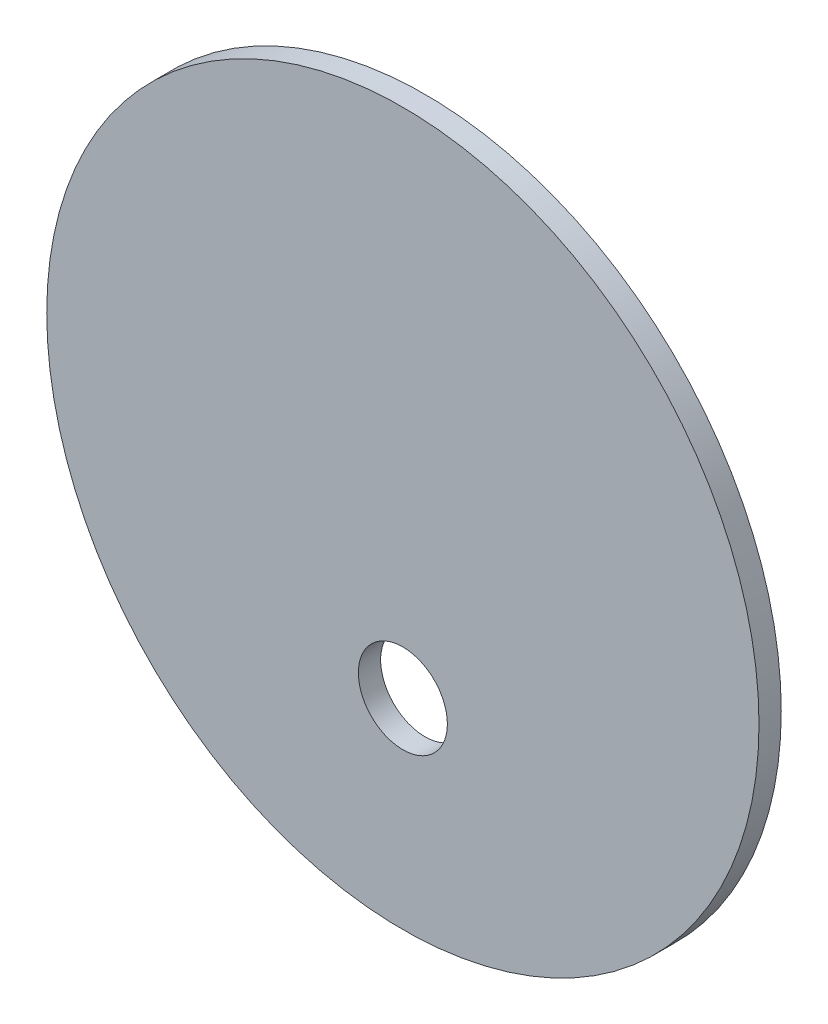
ISO-10303-21;
HEADER;
FILE_DESCRIPTION(('STEP AP214'),'2;1');
FILE_NAME('part.step','',(''),(''),'','','');
FILE_SCHEMA(('AUTOMOTIVE_DESIGN { 1 0 10303 214 1 1 1 1 }'));
ENDSEC;
DATA;
#1=APPLICATION_CONTEXT('core data for automotive mechanical design processes');
#2=APPLICATION_PROTOCOL_DEFINITION('international standard','automotive_design',2000,#1);
#3=PRODUCT_CONTEXT('',#1,'mechanical');
#4=PRODUCT('Part','Part','',(#3));
#5=PRODUCT_RELATED_PRODUCT_CATEGORY('part','',(#4));
#6=PRODUCT_DEFINITION_FORMATION('','',#4);
#7=PRODUCT_DEFINITION_CONTEXT('part definition',#1,'design');
#8=PRODUCT_DEFINITION('design','',#6,#7);
#9=PRODUCT_DEFINITION_SHAPE('','',#8);
#10=(LENGTH_UNIT() NAMED_UNIT(*) SI_UNIT(.MILLI.,.METRE.));
#11=(NAMED_UNIT(*) PLANE_ANGLE_UNIT() SI_UNIT($,.RADIAN.));
#12=(NAMED_UNIT(*) SI_UNIT($,.STERADIAN.) SOLID_ANGLE_UNIT());
#13=UNCERTAINTY_MEASURE_WITH_UNIT(LENGTH_MEASURE(1.E-05),#10,'distance_accuracy_value','');
#14=(GEOMETRIC_REPRESENTATION_CONTEXT(3) GLOBAL_UNCERTAINTY_ASSIGNED_CONTEXT((#13)) GLOBAL_UNIT_ASSIGNED_CONTEXT((#10,
#11,#12)) REPRESENTATION_CONTEXT('',''));
#15=CARTESIAN_POINT('',(0.,0.,0.));
#16=DIRECTION('',(0.,0.,1.));
#17=DIRECTION('',(1.,0.,0.));
#18=AXIS2_PLACEMENT_3D('',#15,#16,#17);
#19=CARTESIAN_POINT('',(0.,0.,5.));
#20=DIRECTION('',(0.,0.,-1.));
#21=DIRECTION('',(-1.,0.,0.));
#22=AXIS2_PLACEMENT_3D('',#19,#20,#21);
#23=CYLINDRICAL_SURFACE('',#22,80.);
#24=CARTESIAN_POINT('',(0.,0.,5.));
#25=DIRECTION('',(0.,0.,1.));
#26=DIRECTION('',(1.,0.,0.));
#27=AXIS2_PLACEMENT_3D('',#24,#25,#26);
#28=CIRCLE('',#27,80.);
#29=CARTESIAN_POINT('',(80.,0.,5.));
#30=VERTEX_POINT('',#29);
#31=EDGE_CURVE('E10',#30,#30,#28,.T.);
#32=ORIENTED_EDGE('',*,*,#31,.F.);
#33=EDGE_LOOP('',(#32));
#34=FACE_BOUND('',#33,.T.);
#35=CARTESIAN_POINT('',(0.,0.,0.));
#36=DIRECTION('',(0.,0.,1.));
#37=DIRECTION('',(1.,0.,0.));
#38=AXIS2_PLACEMENT_3D('',#35,#36,#37);
#39=CIRCLE('',#38,80.);
#40=CARTESIAN_POINT('',(80.,0.,0.));
#41=VERTEX_POINT('',#40);
#42=EDGE_CURVE('E51',#41,#41,#39,.T.);
#43=ORIENTED_EDGE('',*,*,#42,.T.);
#44=EDGE_LOOP('',(#43));
#45=FACE_BOUND('',#44,.T.);
#46=ADVANCED_FACE('F43',(#34,#45),#23,.T.);
#47=CARTESIAN_POINT('',(0.,0.,5.));
#48=DIRECTION('',(0.,0.,1.));
#49=DIRECTION('',(1.,0.,0.));
#50=AXIS2_PLACEMENT_3D('',#47,#48,#49);
#51=PLANE('',#50);
#52=CARTESIAN_POINT('',(0.,-35.,5.));
#53=DIRECTION('',(0.,0.,1.));
#54=DIRECTION('',(1.,0.,0.));
#55=AXIS2_PLACEMENT_3D('',#52,#53,#54);
#56=CIRCLE('',#55,10.);
#57=CARTESIAN_POINT('',(10.,-35.,5.));
#58=VERTEX_POINT('',#57);
#59=EDGE_CURVE('E58',#58,#58,#56,.T.);
#60=ORIENTED_EDGE('',*,*,#59,.F.);
#61=EDGE_LOOP('',(#60));
#62=FACE_BOUND('',#61,.T.);
#63=ORIENTED_EDGE('',*,*,#31,.T.);
#64=EDGE_LOOP('',(#63));
#65=FACE_BOUND('',#64,.T.);
#66=ADVANCED_FACE('F76',(#62,#65),#51,.T.);
#67=CARTESIAN_POINT('',(0.,0.,0.));
#68=DIRECTION('',(0.,0.,1.));
#69=DIRECTION('',(1.,0.,0.));
#70=AXIS2_PLACEMENT_3D('',#67,#68,#69);
#71=PLANE('',#70);
#72=CARTESIAN_POINT('',(0.,-35.,0.));
#73=DIRECTION('',(0.,0.,1.));
#74=DIRECTION('',(1.,0.,0.));
#75=AXIS2_PLACEMENT_3D('',#72,#73,#74);
#76=CIRCLE('',#75,10.);
#77=CARTESIAN_POINT('',(10.,-35.,0.));
#78=VERTEX_POINT('',#77);
#79=EDGE_CURVE('E46',#78,#78,#76,.T.);
#80=ORIENTED_EDGE('',*,*,#79,.T.);
#81=EDGE_LOOP('',(#80));
#82=FACE_BOUND('',#81,.T.);
#83=ORIENTED_EDGE('',*,*,#42,.F.);
#84=EDGE_LOOP('',(#83));
#85=FACE_BOUND('',#84,.T.);
#86=ADVANCED_FACE('F67',(#82,#85),#71,.F.);
#87=CARTESIAN_POINT('',(0.,-35.,-15.));
#88=DIRECTION('',(0.,0.,1.));
#89=DIRECTION('',(1.,0.,0.));
#90=AXIS2_PLACEMENT_3D('',#87,#88,#89);
#91=CYLINDRICAL_SURFACE('',#90,10.);
#92=ORIENTED_EDGE('',*,*,#59,.T.);
#93=EDGE_LOOP('',(#92));
#94=FACE_BOUND('',#93,.T.);
#95=ORIENTED_EDGE('',*,*,#79,.F.);
#96=EDGE_LOOP('',(#95));
#97=FACE_BOUND('',#96,.T.);
#98=ADVANCED_FACE('F70',(#94,#97),#91,.F.);
#99=CLOSED_SHELL('',(#46,#66,#86,#98));
#100=MANIFOLD_SOLID_BREP('B2',#99);
#101=ADVANCED_BREP_SHAPE_REPRESENTATION('',(#18,#100),#14);
#102=SHAPE_DEFINITION_REPRESENTATION(#9,#101);
ENDSEC;
END-ISO-10303-21;
